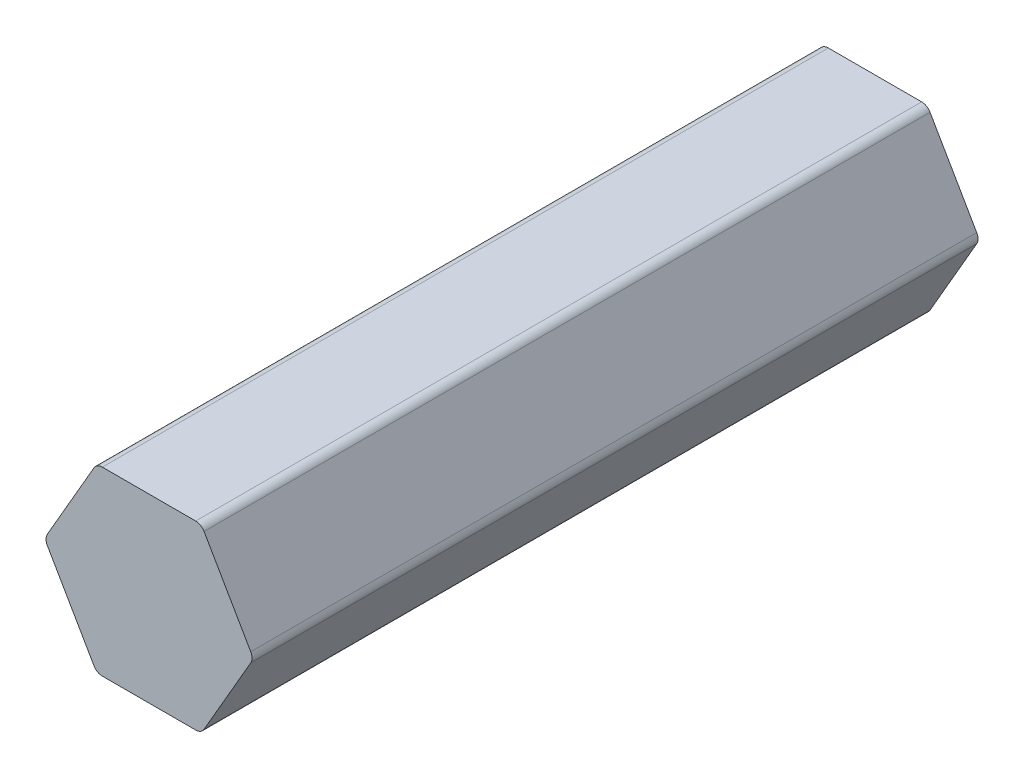
ISO-10303-21;
HEADER;
FILE_DESCRIPTION(('STEP AP214'),'2;1');
FILE_NAME('part.step','',(''),(''),'','','');
FILE_SCHEMA(('AUTOMOTIVE_DESIGN { 1 0 10303 214 1 1 1 1 }'));
ENDSEC;
DATA;
#1=APPLICATION_CONTEXT('core data for automotive mechanical design processes');
#2=APPLICATION_PROTOCOL_DEFINITION('international standard','automotive_design',2000,#1);
#3=PRODUCT_CONTEXT('',#1,'mechanical');
#4=PRODUCT('Part','Part','',(#3));
#5=PRODUCT_RELATED_PRODUCT_CATEGORY('part','',(#4));
#6=PRODUCT_DEFINITION_FORMATION('','',#4);
#7=PRODUCT_DEFINITION_CONTEXT('part definition',#1,'design');
#8=PRODUCT_DEFINITION('design','',#6,#7);
#9=PRODUCT_DEFINITION_SHAPE('','',#8);
#10=(LENGTH_UNIT() NAMED_UNIT(*) SI_UNIT(.MILLI.,.METRE.));
#11=(NAMED_UNIT(*) PLANE_ANGLE_UNIT() SI_UNIT($,.RADIAN.));
#12=(NAMED_UNIT(*) SI_UNIT($,.STERADIAN.) SOLID_ANGLE_UNIT());
#13=UNCERTAINTY_MEASURE_WITH_UNIT(LENGTH_MEASURE(1.E-05),#10,'distance_accuracy_value','');
#14=(GEOMETRIC_REPRESENTATION_CONTEXT(3) GLOBAL_UNCERTAINTY_ASSIGNED_CONTEXT((#13)) GLOBAL_UNIT_ASSIGNED_CONTEXT((#10,
#11,#12)) REPRESENTATION_CONTEXT('',''));
#15=CARTESIAN_POINT('',(0.,0.,0.));
#16=DIRECTION('',(0.,0.,1.));
#17=DIRECTION('',(1.,0.,0.));
#18=AXIS2_PLACEMENT_3D('',#15,#16,#17);
#19=CARTESIAN_POINT('',(2.44900437184856,4.2418,457.2));
#20=DIRECTION('',(0.,0.,-1.));
#21=DIRECTION('',(-1.,0.,0.));
#22=AXIS2_PLACEMENT_3D('',#19,#20,#21);
#23=CYLINDRICAL_SURFACE('',#22,0.508);
#24=DIRECTION('',(0.,0.,-1.));
#25=VECTOR('',#24,1.);
#26=CARTESIAN_POINT('',(2.44900437184856,4.7498,457.2));
#27=LINE('',#26,#25);
#28=CARTESIAN_POINT('',(2.44900437184856,4.7498,-419.1));
#29=VERTEX_POINT('',#28);
#30=CARTESIAN_POINT('',(2.44900437184856,4.7498,-457.2));
#31=VERTEX_POINT('',#30);
#32=EDGE_CURVE('E184',#29,#31,#27,.T.);
#33=ORIENTED_EDGE('',*,*,#32,.F.);
#34=CARTESIAN_POINT('',(2.44900437184856,4.2418,-419.1));
#35=DIRECTION('',(0.,0.,1.));
#36=DIRECTION('',(1.,0.,0.));
#37=AXIS2_PLACEMENT_3D('',#34,#35,#36);
#38=CIRCLE('',#37,0.508);
#39=CARTESIAN_POINT('',(2.88894527697105,4.4958,-419.1));
#40=VERTEX_POINT('',#39);
#41=EDGE_CURVE('E275',#29,#40,#38,.F.);
#42=ORIENTED_EDGE('',*,*,#41,.T.);
#43=DIRECTION('',(0.,0.,1.));
#44=VECTOR('',#43,1.);
#45=CARTESIAN_POINT('',(2.88894527697105,4.4958,457.2));
#46=LINE('',#45,#44);
#47=CARTESIAN_POINT('',(2.88894527697105,4.4958,-457.2));
#48=VERTEX_POINT('',#47);
#49=EDGE_CURVE('E191',#48,#40,#46,.T.);
#50=ORIENTED_EDGE('',*,*,#49,.F.);
#51=CARTESIAN_POINT('',(2.44900437184856,4.2418,-457.2));
#52=DIRECTION('',(0.,0.,-1.));
#53=DIRECTION('',(1.,0.,0.));
#54=AXIS2_PLACEMENT_3D('',#51,#52,#53);
#55=CIRCLE('',#54,0.508);
#56=EDGE_CURVE('E154',#31,#48,#55,.T.);
#57=ORIENTED_EDGE('',*,*,#56,.F.);
#58=EDGE_LOOP('',(#33,#42,#50,#57));
#59=FACE_BOUND('',#58,.T.);
#60=ADVANCED_FACE('F49',(#59),#23,.T.);
#61=CARTESIAN_POINT('',(4.89800874369711,0.,457.2));
#62=DIRECTION('',(0.,0.,-1.));
#63=DIRECTION('',(-1.,0.,0.));
#64=AXIS2_PLACEMENT_3D('',#61,#62,#63);
#65=CYLINDRICAL_SURFACE('',#64,0.508);
#66=DIRECTION('',(0.,0.,-1.));
#67=VECTOR('',#66,1.);
#68=CARTESIAN_POINT('',(5.3379496488196,0.254,457.2));
#69=LINE('',#68,#67);
#70=CARTESIAN_POINT('',(5.33794964881961,0.254000000000003,-419.1));
#71=VERTEX_POINT('',#70);
#72=CARTESIAN_POINT('',(5.3379496488196,0.254,-457.2));
#73=VERTEX_POINT('',#72);
#74=EDGE_CURVE('E171',#71,#73,#69,.T.);
#75=ORIENTED_EDGE('',*,*,#74,.F.);
#76=CARTESIAN_POINT('',(4.89800874369711,0.,-419.1));
#77=DIRECTION('',(0.,0.,1.));
#78=DIRECTION('',(1.,0.,0.));
#79=AXIS2_PLACEMENT_3D('',#76,#77,#78);
#80=CIRCLE('',#79,0.508);
#81=CARTESIAN_POINT('',(5.3379496488196,-0.254,-419.1));
#82=VERTEX_POINT('',#81);
#83=EDGE_CURVE('E271',#71,#82,#80,.F.);
#84=ORIENTED_EDGE('',*,*,#83,.T.);
#85=DIRECTION('',(0.,0.,1.));
#86=VECTOR('',#85,1.);
#87=CARTESIAN_POINT('',(5.3379496488196,-0.254,457.2));
#88=LINE('',#87,#86);
#89=CARTESIAN_POINT('',(5.3379496488196,-0.254,-457.2));
#90=VERTEX_POINT('',#89);
#91=EDGE_CURVE('E155',#90,#82,#88,.T.);
#92=ORIENTED_EDGE('',*,*,#91,.F.);
#93=CARTESIAN_POINT('',(4.89800874369711,0.,-457.2));
#94=DIRECTION('',(0.,0.,-1.));
#95=DIRECTION('',(1.,0.,0.));
#96=AXIS2_PLACEMENT_3D('',#93,#94,#95);
#97=CIRCLE('',#96,0.508);
#98=EDGE_CURVE('E78',#73,#90,#97,.T.);
#99=ORIENTED_EDGE('',*,*,#98,.F.);
#100=EDGE_LOOP('',(#75,#84,#92,#99));
#101=FACE_BOUND('',#100,.T.);
#102=ADVANCED_FACE('F306',(#101),#65,.T.);
#103=CARTESIAN_POINT('',(2.44900437184856,-4.2418,457.2));
#104=DIRECTION('',(0.,0.,-1.));
#105=DIRECTION('',(-1.,0.,0.));
#106=AXIS2_PLACEMENT_3D('',#103,#104,#105);
#107=CYLINDRICAL_SURFACE('',#106,0.508);
#108=DIRECTION('',(0.,0.,-1.));
#109=VECTOR('',#108,1.);
#110=CARTESIAN_POINT('',(2.88894527697105,-4.4958,457.2));
#111=LINE('',#110,#109);
#112=CARTESIAN_POINT('',(2.88894527697105,-4.4958,-419.1));
#113=VERTEX_POINT('',#112);
#114=CARTESIAN_POINT('',(2.88894527697105,-4.4958,-457.2));
#115=VERTEX_POINT('',#114);
#116=EDGE_CURVE('E134',#113,#115,#111,.T.);
#117=ORIENTED_EDGE('',*,*,#116,.F.);
#118=CARTESIAN_POINT('',(2.44900437184856,-4.2418,-419.1));
#119=DIRECTION('',(0.,0.,1.));
#120=DIRECTION('',(1.,0.,0.));
#121=AXIS2_PLACEMENT_3D('',#118,#119,#120);
#122=CIRCLE('',#121,0.508);
#123=CARTESIAN_POINT('',(2.44900437184855,-4.7498,-419.1));
#124=VERTEX_POINT('',#123);
#125=EDGE_CURVE('E130',#113,#124,#122,.F.);
#126=ORIENTED_EDGE('',*,*,#125,.T.);
#127=DIRECTION('',(0.,0.,1.));
#128=VECTOR('',#127,1.);
#129=CARTESIAN_POINT('',(2.44900437184856,-4.7498,457.2));
#130=LINE('',#129,#128);
#131=CARTESIAN_POINT('',(2.44900437184855,-4.7498,-457.2));
#132=VERTEX_POINT('',#131);
#133=EDGE_CURVE('E126',#132,#124,#130,.T.);
#134=ORIENTED_EDGE('',*,*,#133,.F.);
#135=CARTESIAN_POINT('',(2.44900437184856,-4.2418,-457.2));
#136=DIRECTION('',(0.,0.,-1.));
#137=DIRECTION('',(1.,0.,0.));
#138=AXIS2_PLACEMENT_3D('',#135,#136,#137);
#139=CIRCLE('',#138,0.508);
#140=EDGE_CURVE('E58',#115,#132,#139,.T.);
#141=ORIENTED_EDGE('',*,*,#140,.F.);
#142=EDGE_LOOP('',(#117,#126,#134,#141));
#143=FACE_BOUND('',#142,.T.);
#144=ADVANCED_FACE('F127',(#143),#107,.T.);
#145=CARTESIAN_POINT('',(-4.89800874369711,0.,457.2));
#146=DIRECTION('',(0.,0.,-1.));
#147=DIRECTION('',(-1.,0.,0.));
#148=AXIS2_PLACEMENT_3D('',#145,#146,#147);
#149=CYLINDRICAL_SURFACE('',#148,0.508);
#150=DIRECTION('',(0.,0.,-1.));
#151=VECTOR('',#150,1.);
#152=CARTESIAN_POINT('',(-5.40600874369711,0.,457.2));
#153=LINE('',#152,#151);
#154=CARTESIAN_POINT('',(-5.40600874369711,0.,-419.1));
#155=VERTEX_POINT('',#154);
#156=CARTESIAN_POINT('',(-5.40600874369711,0.,-457.2));
#157=VERTEX_POINT('',#156);
#158=EDGE_CURVE('E170',#155,#157,#153,.T.);
#159=ORIENTED_EDGE('',*,*,#158,.F.);
#160=CARTESIAN_POINT('',(-4.89800874369711,0.,-419.1));
#161=DIRECTION('',(0.,0.,1.));
#162=DIRECTION('',(1.,0.,0.));
#163=AXIS2_PLACEMENT_3D('',#160,#161,#162);
#164=CIRCLE('',#163,0.508);
#165=CARTESIAN_POINT('',(-5.3379496488196,0.254000000000002,-419.1));
#166=VERTEX_POINT('',#165);
#167=EDGE_CURVE('E65',#155,#166,#164,.F.);
#168=ORIENTED_EDGE('',*,*,#167,.T.);
#169=DIRECTION('',(0.,0.,1.));
#170=VECTOR('',#169,1.);
#171=CARTESIAN_POINT('',(-5.3379496488196,0.253999999999997,457.2));
#172=LINE('',#171,#170);
#173=CARTESIAN_POINT('',(-5.3379496488196,0.254,-457.2));
#174=VERTEX_POINT('',#173);
#175=EDGE_CURVE('E160',#174,#166,#172,.T.);
#176=ORIENTED_EDGE('',*,*,#175,.F.);
#177=CARTESIAN_POINT('',(-4.89800874369711,0.,-457.2));
#178=DIRECTION('',(0.,0.,-1.));
#179=DIRECTION('',(1.,0.,0.));
#180=AXIS2_PLACEMENT_3D('',#177,#178,#179);
#181=CIRCLE('',#180,0.508);
#182=EDGE_CURVE('E178',#157,#174,#181,.T.);
#183=ORIENTED_EDGE('',*,*,#182,.F.);
#184=EDGE_LOOP('',(#159,#168,#176,#183));
#185=FACE_BOUND('',#184,.T.);
#186=ADVANCED_FACE('F237',(#185),#149,.T.);
#187=CARTESIAN_POINT('',(-2.44900437184856,4.2418,457.2));
#188=DIRECTION('',(0.,0.,-1.));
#189=DIRECTION('',(-1.,0.,0.));
#190=AXIS2_PLACEMENT_3D('',#187,#188,#189);
#191=CYLINDRICAL_SURFACE('',#190,0.508);
#192=DIRECTION('',(0.,0.,-1.));
#193=VECTOR('',#192,1.);
#194=CARTESIAN_POINT('',(-2.88894527697105,4.4958,457.2));
#195=LINE('',#194,#193);
#196=CARTESIAN_POINT('',(-2.88894527697105,4.4958,-419.1));
#197=VERTEX_POINT('',#196);
#198=CARTESIAN_POINT('',(-2.88894527697105,4.4958,-457.2));
#199=VERTEX_POINT('',#198);
#200=EDGE_CURVE('E181',#197,#199,#195,.T.);
#201=ORIENTED_EDGE('',*,*,#200,.F.);
#202=CARTESIAN_POINT('',(-2.44900437184856,4.2418,-419.1));
#203=DIRECTION('',(0.,0.,1.));
#204=DIRECTION('',(1.,0.,0.));
#205=AXIS2_PLACEMENT_3D('',#202,#203,#204);
#206=CIRCLE('',#205,0.508);
#207=CARTESIAN_POINT('',(-2.44900437184856,4.7498,-419.1));
#208=VERTEX_POINT('',#207);
#209=EDGE_CURVE('E257',#197,#208,#206,.F.);
#210=ORIENTED_EDGE('',*,*,#209,.T.);
#211=DIRECTION('',(0.,0.,1.));
#212=VECTOR('',#211,1.);
#213=CARTESIAN_POINT('',(-2.44900437184856,4.7498,457.2));
#214=LINE('',#213,#212);
#215=CARTESIAN_POINT('',(-2.44900437184856,4.7498,-457.2));
#216=VERTEX_POINT('',#215);
#217=EDGE_CURVE('E196',#216,#208,#214,.T.);
#218=ORIENTED_EDGE('',*,*,#217,.F.);
#219=CARTESIAN_POINT('',(-2.44900437184856,4.2418,-457.2));
#220=DIRECTION('',(0.,0.,-1.));
#221=DIRECTION('',(1.,0.,0.));
#222=AXIS2_PLACEMENT_3D('',#219,#220,#221);
#223=CIRCLE('',#222,0.508);
#224=EDGE_CURVE('E200',#199,#216,#223,.T.);
#225=ORIENTED_EDGE('',*,*,#224,.F.);
#226=EDGE_LOOP('',(#201,#210,#218,#225));
#227=FACE_BOUND('',#226,.T.);
#228=ADVANCED_FACE('F546',(#227),#191,.T.);
#229=CARTESIAN_POINT('',(-2.44900437184855,-4.2418,457.2));
#230=DIRECTION('',(0.,0.,-1.));
#231=DIRECTION('',(-1.,0.,0.));
#232=AXIS2_PLACEMENT_3D('',#229,#230,#231);
#233=CYLINDRICAL_SURFACE('',#232,0.508);
#234=DIRECTION('',(0.,0.,-1.));
#235=VECTOR('',#234,1.);
#236=CARTESIAN_POINT('',(-2.44900437184855,-4.7498,457.2));
#237=LINE('',#236,#235);
#238=CARTESIAN_POINT('',(-2.44900437184855,-4.7498,-419.1));
#239=VERTEX_POINT('',#238);
#240=CARTESIAN_POINT('',(-2.44900437184855,-4.7498,-457.2));
#241=VERTEX_POINT('',#240);
#242=EDGE_CURVE('E138',#239,#241,#237,.T.);
#243=ORIENTED_EDGE('',*,*,#242,.F.);
#244=CARTESIAN_POINT('',(-2.44900437184855,-4.2418,-419.1));
#245=DIRECTION('',(0.,0.,1.));
#246=DIRECTION('',(1.,0.,0.));
#247=AXIS2_PLACEMENT_3D('',#244,#245,#246);
#248=CIRCLE('',#247,0.508);
#249=CARTESIAN_POINT('',(-2.88894527697105,-4.4958,-419.1));
#250=VERTEX_POINT('',#249);
#251=EDGE_CURVE('E243',#239,#250,#248,.F.);
#252=ORIENTED_EDGE('',*,*,#251,.T.);
#253=DIRECTION('',(0.,0.,1.));
#254=VECTOR('',#253,1.);
#255=CARTESIAN_POINT('',(-2.88894527697104,-4.4958,457.2));
#256=LINE('',#255,#254);
#257=CARTESIAN_POINT('',(-2.88894527697104,-4.4958,-457.2));
#258=VERTEX_POINT('',#257);
#259=EDGE_CURVE('E144',#258,#250,#256,.T.);
#260=ORIENTED_EDGE('',*,*,#259,.F.);
#261=CARTESIAN_POINT('',(-2.44900437184855,-4.2418,-457.2));
#262=DIRECTION('',(0.,0.,-1.));
#263=DIRECTION('',(1.,0.,0.));
#264=AXIS2_PLACEMENT_3D('',#261,#262,#263);
#265=CIRCLE('',#264,0.508);
#266=EDGE_CURVE('E159',#241,#258,#265,.T.);
#267=ORIENTED_EDGE('',*,*,#266,.F.);
#268=EDGE_LOOP('',(#243,#252,#260,#267));
#269=FACE_BOUND('',#268,.T.);
#270=ADVANCED_FACE('F326',(#269),#233,.T.);
#271=CARTESIAN_POINT('',(2.74229830859688,-4.7498,457.2));
#272=DIRECTION('',(-0.866025403784439,0.5,0.));
#273=DIRECTION('',(0.,0.,1.));
#274=AXIS2_PLACEMENT_3D('',#271,#272,#273);
#275=PLANE('',#274);
#276=DIRECTION('',(0.5,0.866025403784439,0.));
#277=VECTOR('',#276,1.);
#278=CARTESIAN_POINT('',(2.74229830859688,-4.7498,-419.1));
#279=LINE('',#278,#277);
#280=EDGE_CURVE('E267',#113,#82,#279,.T.);
#281=ORIENTED_EDGE('',*,*,#280,.F.);
#282=ORIENTED_EDGE('',*,*,#116,.T.);
#283=DIRECTION('',(0.5,0.866025403784439,0.));
#284=VECTOR('',#283,1.);
#285=CARTESIAN_POINT('',(2.74229830859688,-4.7498,-457.2));
#286=LINE('',#285,#284);
#287=EDGE_CURVE('E119',#115,#90,#286,.T.);
#288=ORIENTED_EDGE('',*,*,#287,.T.);
#289=ORIENTED_EDGE('',*,*,#91,.T.);
#290=EDGE_LOOP('',(#281,#282,#288,#289));
#291=FACE_BOUND('',#290,.T.);
#292=ADVANCED_FACE('F311',(#291),#275,.F.);
#293=CARTESIAN_POINT('',(-2.74229830859688,-4.7498,457.2));
#294=DIRECTION('',(0.,1.,0.));
#295=DIRECTION('',(1.,0.,0.));
#296=AXIS2_PLACEMENT_3D('',#293,#294,#295);
#297=PLANE('',#296);
#298=DIRECTION('',(1.,0.,0.));
#299=VECTOR('',#298,1.);
#300=CARTESIAN_POINT('',(-2.74229830859688,-4.7498,-419.1));
#301=LINE('',#300,#299);
#302=EDGE_CURVE('E247',#239,#124,#301,.T.);
#303=ORIENTED_EDGE('',*,*,#302,.F.);
#304=ORIENTED_EDGE('',*,*,#242,.T.);
#305=DIRECTION('',(1.,0.,0.));
#306=VECTOR('',#305,1.);
#307=CARTESIAN_POINT('',(-2.74229830859688,-4.7498,-457.2));
#308=LINE('',#307,#306);
#309=EDGE_CURVE('E117',#241,#132,#308,.T.);
#310=ORIENTED_EDGE('',*,*,#309,.T.);
#311=ORIENTED_EDGE('',*,*,#133,.T.);
#312=EDGE_LOOP('',(#303,#304,#310,#311));
#313=FACE_BOUND('',#312,.T.);
#314=ADVANCED_FACE('F136',(#313),#297,.F.);
#315=CARTESIAN_POINT('',(-5.48459661719377,0.,457.2));
#316=DIRECTION('',(0.866025403784438,0.5,0.));
#317=DIRECTION('',(0.,0.,-1.));
#318=AXIS2_PLACEMENT_3D('',#315,#316,#317);
#319=PLANE('',#318);
#320=DIRECTION('',(0.5,-0.866025403784438,0.));
#321=VECTOR('',#320,1.);
#322=CARTESIAN_POINT('',(-5.48459661719377,0.,-419.1));
#323=LINE('',#322,#321);
#324=CARTESIAN_POINT('',(-5.33794964881961,-0.254000000000003,-419.1));
#325=VERTEX_POINT('',#324);
#326=EDGE_CURVE('E250',#325,#250,#323,.T.);
#327=ORIENTED_EDGE('',*,*,#326,.F.);
#328=DIRECTION('',(0.,0.,-1.));
#329=VECTOR('',#328,1.);
#330=CARTESIAN_POINT('',(-5.3379496488196,-0.254,457.2));
#331=LINE('',#330,#329);
#332=CARTESIAN_POINT('',(-5.3379496488196,-0.254,-457.2));
#333=VERTEX_POINT('',#332);
#334=EDGE_CURVE('E148',#325,#333,#331,.T.);
#335=ORIENTED_EDGE('',*,*,#334,.T.);
#336=DIRECTION('',(0.5,-0.866025403784439,0.));
#337=VECTOR('',#336,1.);
#338=CARTESIAN_POINT('',(-5.48459661719377,0.,-457.2));
#339=LINE('',#338,#337);
#340=EDGE_CURVE('E164',#333,#258,#339,.T.);
#341=ORIENTED_EDGE('',*,*,#340,.T.);
#342=ORIENTED_EDGE('',*,*,#259,.T.);
#343=EDGE_LOOP('',(#327,#335,#341,#342));
#344=FACE_BOUND('',#343,.T.);
#345=ADVANCED_FACE('F332',(#344),#319,.F.);
#346=CARTESIAN_POINT('',(-2.74229830859688,4.7498,457.2));
#347=DIRECTION('',(0.866025403784439,-0.5,0.));
#348=DIRECTION('',(0.,0.,-1.));
#349=AXIS2_PLACEMENT_3D('',#346,#347,#348);
#350=PLANE('',#349);
#351=DIRECTION('',(-0.5,-0.866025403784439,0.));
#352=VECTOR('',#351,1.);
#353=CARTESIAN_POINT('',(-2.74229830859688,4.7498,-419.1));
#354=LINE('',#353,#352);
#355=EDGE_CURVE('E242',#197,#166,#354,.T.);
#356=ORIENTED_EDGE('',*,*,#355,.F.);
#357=ORIENTED_EDGE('',*,*,#200,.T.);
#358=DIRECTION('',(-0.5,-0.866025403784439,0.));
#359=VECTOR('',#358,1.);
#360=CARTESIAN_POINT('',(-2.74229830859688,4.7498,-457.2));
#361=LINE('',#360,#359);
#362=EDGE_CURVE('E165',#199,#174,#361,.T.);
#363=ORIENTED_EDGE('',*,*,#362,.T.);
#364=ORIENTED_EDGE('',*,*,#175,.T.);
#365=EDGE_LOOP('',(#356,#357,#363,#364));
#366=FACE_BOUND('',#365,.T.);
#367=ADVANCED_FACE('F223',(#366),#350,.F.);
#368=CARTESIAN_POINT('',(2.74229830859688,4.7498,457.2));
#369=DIRECTION('',(0.,-1.,0.));
#370=DIRECTION('',(0.,0.,-1.));
#371=AXIS2_PLACEMENT_3D('',#368,#369,#370);
#372=PLANE('',#371);
#373=DIRECTION('',(-1.,0.,0.));
#374=VECTOR('',#373,1.);
#375=CARTESIAN_POINT('',(2.74229830859688,4.7498,-419.1));
#376=LINE('',#375,#374);
#377=EDGE_CURVE('E263',#29,#208,#376,.T.);
#378=ORIENTED_EDGE('',*,*,#377,.F.);
#379=ORIENTED_EDGE('',*,*,#32,.T.);
#380=DIRECTION('',(-1.,0.,0.));
#381=VECTOR('',#380,1.);
#382=CARTESIAN_POINT('',(2.74229830859688,4.7498,-457.2));
#383=LINE('',#382,#381);
#384=EDGE_CURVE('E195',#31,#216,#383,.T.);
#385=ORIENTED_EDGE('',*,*,#384,.T.);
#386=ORIENTED_EDGE('',*,*,#217,.T.);
#387=EDGE_LOOP('',(#378,#379,#385,#386));
#388=FACE_BOUND('',#387,.T.);
#389=ADVANCED_FACE('F286',(#388),#372,.F.);
#390=CARTESIAN_POINT('',(5.48459661719377,0.,457.2));
#391=DIRECTION('',(-0.866025403784439,-0.5,0.));
#392=DIRECTION('',(-0.5,0.866025403784439,0.));
#393=AXIS2_PLACEMENT_3D('',#390,#391,#392);
#394=PLANE('',#393);
#395=DIRECTION('',(-0.5,0.866025403784439,0.));
#396=VECTOR('',#395,1.);
#397=CARTESIAN_POINT('',(5.48459661719377,0.,-419.1));
#398=LINE('',#397,#396);
#399=EDGE_CURVE('E215',#71,#40,#398,.T.);
#400=ORIENTED_EDGE('',*,*,#399,.F.);
#401=ORIENTED_EDGE('',*,*,#74,.T.);
#402=DIRECTION('',(-0.5,0.866025403784439,0.));
#403=VECTOR('',#402,1.);
#404=CARTESIAN_POINT('',(5.48459661719377,0.,-457.2));
#405=LINE('',#404,#403);
#406=EDGE_CURVE('E175',#73,#48,#405,.T.);
#407=ORIENTED_EDGE('',*,*,#406,.T.);
#408=ORIENTED_EDGE('',*,*,#49,.T.);
#409=EDGE_LOOP('',(#400,#401,#407,#408));
#410=FACE_BOUND('',#409,.T.);
#411=ADVANCED_FACE('F300',(#410),#394,.F.);
#412=CARTESIAN_POINT('',(-4.89800874369711,0.,457.2));
#413=DIRECTION('',(0.,0.,-1.));
#414=DIRECTION('',(-1.,0.,0.));
#415=AXIS2_PLACEMENT_3D('',#412,#413,#414);
#416=CYLINDRICAL_SURFACE('',#415,0.508);
#417=ORIENTED_EDGE('',*,*,#334,.F.);
#418=CARTESIAN_POINT('',(-4.89800874369711,0.,-419.1));
#419=DIRECTION('',(0.,0.,1.));
#420=DIRECTION('',(1.,0.,0.));
#421=AXIS2_PLACEMENT_3D('',#418,#419,#420);
#422=CIRCLE('',#421,0.508);
#423=EDGE_CURVE('E11',#325,#155,#422,.F.);
#424=ORIENTED_EDGE('',*,*,#423,.T.);
#425=ORIENTED_EDGE('',*,*,#158,.T.);
#426=CARTESIAN_POINT('',(-4.89800874369711,0.,-457.2));
#427=DIRECTION('',(0.,0.,-1.));
#428=DIRECTION('',(1.,0.,0.));
#429=AXIS2_PLACEMENT_3D('',#426,#427,#428);
#430=CIRCLE('',#429,0.508);
#431=EDGE_CURVE('E166',#333,#157,#430,.T.);
#432=ORIENTED_EDGE('',*,*,#431,.F.);
#433=EDGE_LOOP('',(#417,#424,#425,#432));
#434=FACE_BOUND('',#433,.T.);
#435=ADVANCED_FACE('F412',(#434),#416,.T.);
#436=CARTESIAN_POINT('',(2.74229830859688,4.7498,-457.2));
#437=DIRECTION('',(0.,0.,1.));
#438=DIRECTION('',(1.,0.,0.));
#439=AXIS2_PLACEMENT_3D('',#436,#437,#438);
#440=PLANE('',#439);
#441=ORIENTED_EDGE('',*,*,#309,.F.);
#442=ORIENTED_EDGE('',*,*,#266,.T.);
#443=ORIENTED_EDGE('',*,*,#340,.F.);
#444=ORIENTED_EDGE('',*,*,#431,.T.);
#445=ORIENTED_EDGE('',*,*,#182,.T.);
#446=ORIENTED_EDGE('',*,*,#362,.F.);
#447=ORIENTED_EDGE('',*,*,#224,.T.);
#448=ORIENTED_EDGE('',*,*,#384,.F.);
#449=ORIENTED_EDGE('',*,*,#56,.T.);
#450=ORIENTED_EDGE('',*,*,#406,.F.);
#451=ORIENTED_EDGE('',*,*,#98,.T.);
#452=ORIENTED_EDGE('',*,*,#287,.F.);
#453=ORIENTED_EDGE('',*,*,#140,.T.);
#454=EDGE_LOOP('',(#441,#442,#443,#444,#445,#446,#447,#448,#449,#450,#451,#452,#453));
#455=FACE_BOUND('',#454,.T.);
#456=ADVANCED_FACE('F51',(#455),#440,.F.);
#457=CARTESIAN_POINT('',(0.,0.,-419.1));
#458=DIRECTION('',(0.,0.,1.));
#459=DIRECTION('',(1.,0.,0.));
#460=AXIS2_PLACEMENT_3D('',#457,#458,#459);
#461=PLANE('',#460);
#462=ORIENTED_EDGE('',*,*,#399,.T.);
#463=ORIENTED_EDGE('',*,*,#41,.F.);
#464=ORIENTED_EDGE('',*,*,#377,.T.);
#465=ORIENTED_EDGE('',*,*,#209,.F.);
#466=ORIENTED_EDGE('',*,*,#355,.T.);
#467=ORIENTED_EDGE('',*,*,#167,.F.);
#468=ORIENTED_EDGE('',*,*,#423,.F.);
#469=ORIENTED_EDGE('',*,*,#326,.T.);
#470=ORIENTED_EDGE('',*,*,#251,.F.);
#471=ORIENTED_EDGE('',*,*,#302,.T.);
#472=ORIENTED_EDGE('',*,*,#125,.F.);
#473=ORIENTED_EDGE('',*,*,#280,.T.);
#474=ORIENTED_EDGE('',*,*,#83,.F.);
#475=EDGE_LOOP('',(#462,#463,#464,#465,#466,#467,#468,#469,#470,#471,#472,#473,#474));
#476=FACE_BOUND('',#475,.T.);
#477=ADVANCED_FACE('F411',(#476),#461,.T.);
#478=CLOSED_SHELL('',(#60,#102,#144,#186,#228,#270,#292,#314,#345,#367,#389,#411,#435,#456,#477));
#479=MANIFOLD_SOLID_BREP('B2',#478);
#480=ADVANCED_BREP_SHAPE_REPRESENTATION('',(#18,#479),#14);
#481=SHAPE_DEFINITION_REPRESENTATION(#9,#480);
ENDSEC;
END-ISO-10303-21;
